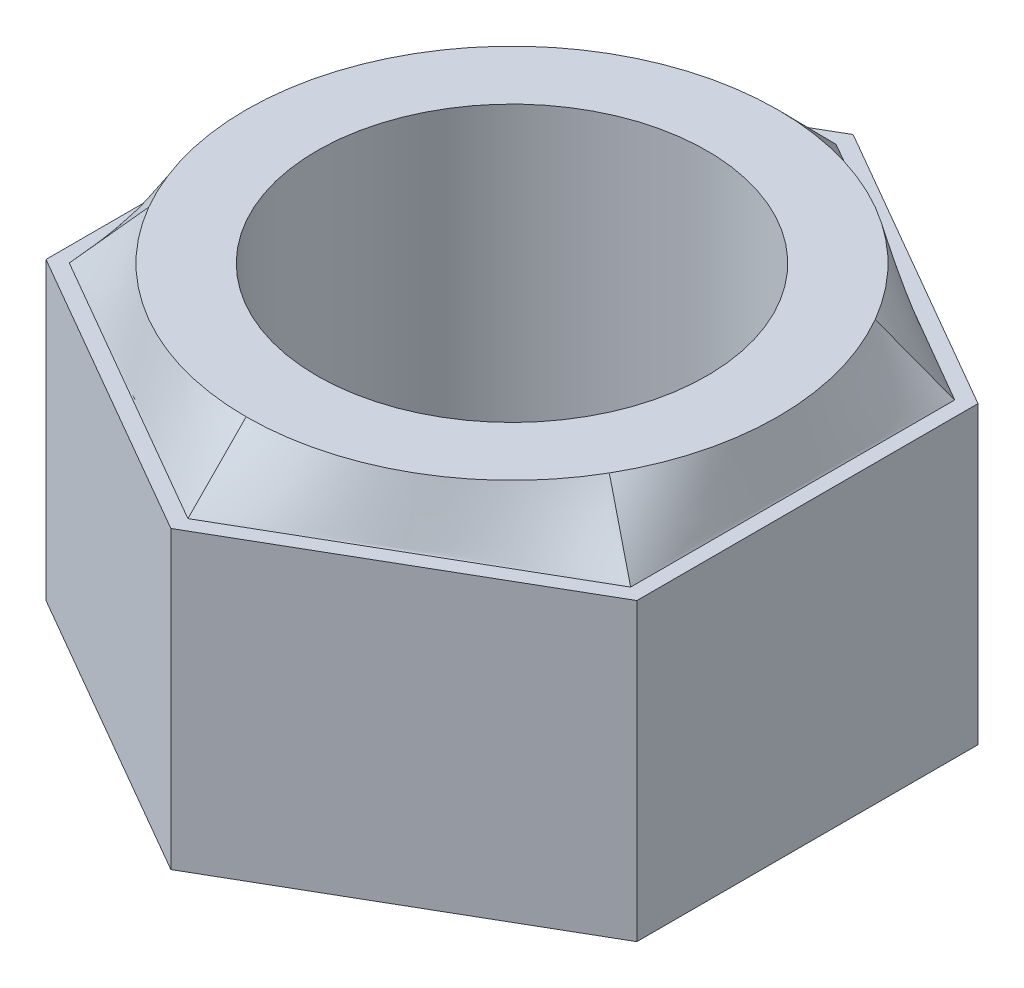
ISO-10303-21;
HEADER;
FILE_DESCRIPTION(('STEP AP214'),'2;1');
FILE_NAME('part.step','',(''),(''),'','','');
FILE_SCHEMA(('AUTOMOTIVE_DESIGN { 1 0 10303 214 1 1 1 1 }'));
ENDSEC;
DATA;
#1=APPLICATION_CONTEXT('core data for automotive mechanical design processes');
#2=APPLICATION_PROTOCOL_DEFINITION('international standard','automotive_design',2000,#1);
#3=PRODUCT_CONTEXT('',#1,'mechanical');
#4=PRODUCT('Part','Part','',(#3));
#5=PRODUCT_RELATED_PRODUCT_CATEGORY('part','',(#4));
#6=PRODUCT_DEFINITION_FORMATION('','',#4);
#7=PRODUCT_DEFINITION_CONTEXT('part definition',#1,'design');
#8=PRODUCT_DEFINITION('design','',#6,#7);
#9=PRODUCT_DEFINITION_SHAPE('','',#8);
#10=(LENGTH_UNIT() NAMED_UNIT(*) SI_UNIT(.MILLI.,.METRE.));
#11=(NAMED_UNIT(*) PLANE_ANGLE_UNIT() SI_UNIT($,.RADIAN.));
#12=(NAMED_UNIT(*) SI_UNIT($,.STERADIAN.) SOLID_ANGLE_UNIT());
#13=UNCERTAINTY_MEASURE_WITH_UNIT(LENGTH_MEASURE(1.E-05),#10,'distance_accuracy_value','');
#14=(GEOMETRIC_REPRESENTATION_CONTEXT(3) GLOBAL_UNCERTAINTY_ASSIGNED_CONTEXT((#13)) GLOBAL_UNIT_ASSIGNED_CONTEXT((#10,
#11,#12)) REPRESENTATION_CONTEXT('',''));
#15=CARTESIAN_POINT('',(0.,0.,0.));
#16=DIRECTION('',(0.,0.,1.));
#17=DIRECTION('',(1.,0.,0.));
#18=AXIS2_PLACEMENT_3D('',#15,#16,#17);
#19=CARTESIAN_POINT('',(0.,5.,0.));
#20=DIRECTION('',(0.,1.,0.));
#21=DIRECTION('',(0.,0.,1.));
#22=AXIS2_PLACEMENT_3D('',#19,#20,#21);
#23=PLANE('',#22);
#24=DIRECTION('',(-0.866025403784438,0.,-0.5));
#25=VECTOR('',#24,1.);
#26=CARTESIAN_POINT('',(5.,5.,-2.88675134594813));
#27=LINE('',#26,#25);
#28=CARTESIAN_POINT('',(5.,5.,-2.88675134594813));
#29=VERTEX_POINT('',#28);
#30=CARTESIAN_POINT('',(0.,5.,-5.77350269189626));
#31=VERTEX_POINT('',#30);
#32=EDGE_CURVE('E186',#29,#31,#27,.T.);
#33=ORIENTED_EDGE('',*,*,#32,.T.);
#34=DIRECTION('',(-0.866025403784438,0.,0.5));
#35=VECTOR('',#34,1.);
#36=CARTESIAN_POINT('',(0.,5.,-5.77350269189626));
#37=LINE('',#36,#35);
#38=CARTESIAN_POINT('',(-5.,5.,-2.88675134594813));
#39=VERTEX_POINT('',#38);
#40=EDGE_CURVE('E137',#31,#39,#37,.T.);
#41=ORIENTED_EDGE('',*,*,#40,.T.);
#42=DIRECTION('',(0.,0.,1.));
#43=VECTOR('',#42,1.);
#44=CARTESIAN_POINT('',(-5.,5.,-2.88675134594813));
#45=LINE('',#44,#43);
#46=CARTESIAN_POINT('',(-5.,5.,2.88675134594813));
#47=VERTEX_POINT('',#46);
#48=EDGE_CURVE('E153',#39,#47,#45,.T.);
#49=ORIENTED_EDGE('',*,*,#48,.T.);
#50=DIRECTION('',(0.866025403784439,0.,0.5));
#51=VECTOR('',#50,1.);
#52=CARTESIAN_POINT('',(-5.,5.,2.88675134594813));
#53=LINE('',#52,#51);
#54=CARTESIAN_POINT('',(0.,5.,5.77350269189626));
#55=VERTEX_POINT('',#54);
#56=EDGE_CURVE('E146',#47,#55,#53,.T.);
#57=ORIENTED_EDGE('',*,*,#56,.T.);
#58=DIRECTION('',(0.866025403784439,0.,-0.5));
#59=VECTOR('',#58,1.);
#60=CARTESIAN_POINT('',(0.,5.,5.77350269189626));
#61=LINE('',#60,#59);
#62=CARTESIAN_POINT('',(5.,5.,2.88675134594813));
#63=VERTEX_POINT('',#62);
#64=EDGE_CURVE('E150',#55,#63,#61,.T.);
#65=ORIENTED_EDGE('',*,*,#64,.T.);
#66=DIRECTION('',(0.,0.,-1.));
#67=VECTOR('',#66,1.);
#68=CARTESIAN_POINT('',(5.,5.,2.88675134594813));
#69=LINE('',#68,#67);
#70=EDGE_CURVE('E102',#63,#29,#69,.T.);
#71=ORIENTED_EDGE('',*,*,#70,.T.);
#72=EDGE_LOOP('',(#33,#41,#49,#57,#65,#71));
#73=FACE_BOUND('',#72,.T.);
#74=DIRECTION('',(-0.866025403784438,0.,-0.5));
#75=VECTOR('',#74,1.);
#76=CARTESIAN_POINT('',(4.75,5.,-2.74241377865072));
#77=LINE('',#76,#75);
#78=CARTESIAN_POINT('',(4.75,5.,-2.74241377865072));
#79=VERTEX_POINT('',#78);
#80=CARTESIAN_POINT('',(0.,5.,-5.48482755730145));
#81=VERTEX_POINT('',#80);
#82=EDGE_CURVE('E194',#79,#81,#77,.T.);
#83=ORIENTED_EDGE('',*,*,#82,.F.);
#84=DIRECTION('',(0.,0.,-1.));
#85=VECTOR('',#84,1.);
#86=CARTESIAN_POINT('',(4.75,5.,2.74241377865072));
#87=LINE('',#86,#85);
#88=CARTESIAN_POINT('',(4.75,5.,2.74241377865072));
#89=VERTEX_POINT('',#88);
#90=EDGE_CURVE('E192',#89,#79,#87,.T.);
#91=ORIENTED_EDGE('',*,*,#90,.F.);
#92=DIRECTION('',(0.866025403784439,0.,-0.5));
#93=VECTOR('',#92,1.);
#94=CARTESIAN_POINT('',(0.,5.,5.48482755730145));
#95=LINE('',#94,#93);
#96=CARTESIAN_POINT('',(0.,5.,5.48482755730145));
#97=VERTEX_POINT('',#96);
#98=EDGE_CURVE('E198',#97,#89,#95,.T.);
#99=ORIENTED_EDGE('',*,*,#98,.F.);
#100=DIRECTION('',(0.866025403784439,0.,0.5));
#101=VECTOR('',#100,1.);
#102=CARTESIAN_POINT('',(-4.75,5.,2.74241377865073));
#103=LINE('',#102,#101);
#104=CARTESIAN_POINT('',(-4.75,5.,2.74241377865073));
#105=VERTEX_POINT('',#104);
#106=EDGE_CURVE('E202',#105,#97,#103,.T.);
#107=ORIENTED_EDGE('',*,*,#106,.F.);
#108=DIRECTION('',(0.,0.,1.));
#109=VECTOR('',#108,1.);
#110=CARTESIAN_POINT('',(-4.75,5.,-2.74241377865072));
#111=LINE('',#110,#109);
#112=CARTESIAN_POINT('',(-4.75,5.,-2.74241377865072));
#113=VERTEX_POINT('',#112);
#114=EDGE_CURVE('E207',#113,#105,#111,.T.);
#115=ORIENTED_EDGE('',*,*,#114,.F.);
#116=DIRECTION('',(-0.866025403784439,0.,0.5));
#117=VECTOR('',#116,1.);
#118=CARTESIAN_POINT('',(0.,5.,-5.48482755730145));
#119=LINE('',#118,#117);
#120=EDGE_CURVE('E212',#81,#113,#119,.T.);
#121=ORIENTED_EDGE('',*,*,#120,.F.);
#122=EDGE_LOOP('',(#83,#91,#99,#107,#115,#121));
#123=FACE_BOUND('',#122,.T.);
#124=ADVANCED_FACE('F76',(#73,#123),#23,.T.);
#125=CARTESIAN_POINT('',(5.,5.,-2.88675134594813));
#126=DIRECTION('',(-0.5,0.,0.866025403784438));
#127=DIRECTION('',(0.866025403784439,0.,0.5));
#128=AXIS2_PLACEMENT_3D('',#125,#126,#127);
#129=PLANE('',#128);
#130=DIRECTION('',(-0.866025403784438,0.,-0.5));
#131=VECTOR('',#130,1.);
#132=CARTESIAN_POINT('',(5.,0.,-2.88675134594813));
#133=LINE('',#132,#131);
#134=CARTESIAN_POINT('',(5.,0.,-2.88675134594813));
#135=VERTEX_POINT('',#134);
#136=CARTESIAN_POINT('',(0.,0.,-5.77350269189626));
#137=VERTEX_POINT('',#136);
#138=EDGE_CURVE('E174',#135,#137,#133,.T.);
#139=ORIENTED_EDGE('',*,*,#138,.T.);
#140=DIRECTION('',(0.,-1.,0.));
#141=VECTOR('',#140,1.);
#142=CARTESIAN_POINT('',(0.,5.,-5.77350269189626));
#143=LINE('',#142,#141);
#144=EDGE_CURVE('E12',#31,#137,#143,.T.);
#145=ORIENTED_EDGE('',*,*,#144,.F.);
#146=ORIENTED_EDGE('',*,*,#32,.F.);
#147=DIRECTION('',(0.,-1.,0.));
#148=VECTOR('',#147,1.);
#149=CARTESIAN_POINT('',(5.,5.,-2.88675134594813));
#150=LINE('',#149,#148);
#151=EDGE_CURVE('E170',#29,#135,#150,.T.);
#152=ORIENTED_EDGE('',*,*,#151,.T.);
#153=EDGE_LOOP('',(#139,#145,#146,#152));
#154=FACE_BOUND('',#153,.T.);
#155=ADVANCED_FACE('F78',(#154),#129,.F.);
#156=CARTESIAN_POINT('',(0.,5.,-5.77350269189626));
#157=DIRECTION('',(0.5,0.,0.866025403784439));
#158=DIRECTION('',(0.866025403784439,0.,-0.5));
#159=AXIS2_PLACEMENT_3D('',#156,#157,#158);
#160=PLANE('',#159);
#161=DIRECTION('',(-0.866025403784438,0.,0.5));
#162=VECTOR('',#161,1.);
#163=CARTESIAN_POINT('',(0.,0.,-5.77350269189626));
#164=LINE('',#163,#162);
#165=CARTESIAN_POINT('',(-5.,0.,-2.88675134594813));
#166=VERTEX_POINT('',#165);
#167=EDGE_CURVE('E177',#137,#166,#164,.T.);
#168=ORIENTED_EDGE('',*,*,#167,.T.);
#169=DIRECTION('',(0.,-1.,0.));
#170=VECTOR('',#169,1.);
#171=CARTESIAN_POINT('',(-5.,5.,-2.88675134594813));
#172=LINE('',#171,#170);
#173=EDGE_CURVE('E85',#39,#166,#172,.T.);
#174=ORIENTED_EDGE('',*,*,#173,.F.);
#175=ORIENTED_EDGE('',*,*,#40,.F.);
#176=ORIENTED_EDGE('',*,*,#144,.T.);
#177=EDGE_LOOP('',(#168,#174,#175,#176));
#178=FACE_BOUND('',#177,.T.);
#179=ADVANCED_FACE('F461',(#178),#160,.F.);
#180=CARTESIAN_POINT('',(-5.,5.,-2.88675134594813));
#181=DIRECTION('',(1.,0.,0.));
#182=DIRECTION('',(0.,0.,-1.));
#183=AXIS2_PLACEMENT_3D('',#180,#181,#182);
#184=PLANE('',#183);
#185=DIRECTION('',(0.,0.,1.));
#186=VECTOR('',#185,1.);
#187=CARTESIAN_POINT('',(-5.,0.,-2.88675134594813));
#188=LINE('',#187,#186);
#189=CARTESIAN_POINT('',(-5.,0.,2.88675134594813));
#190=VERTEX_POINT('',#189);
#191=EDGE_CURVE('E180',#166,#190,#188,.T.);
#192=ORIENTED_EDGE('',*,*,#191,.T.);
#193=DIRECTION('',(0.,-1.,0.));
#194=VECTOR('',#193,1.);
#195=CARTESIAN_POINT('',(-5.,5.,2.88675134594813));
#196=LINE('',#195,#194);
#197=EDGE_CURVE('E165',#47,#190,#196,.T.);
#198=ORIENTED_EDGE('',*,*,#197,.F.);
#199=ORIENTED_EDGE('',*,*,#48,.F.);
#200=ORIENTED_EDGE('',*,*,#173,.T.);
#201=EDGE_LOOP('',(#192,#198,#199,#200));
#202=FACE_BOUND('',#201,.T.);
#203=ADVANCED_FACE('F466',(#202),#184,.F.);
#204=CARTESIAN_POINT('',(-5.,5.,2.88675134594813));
#205=DIRECTION('',(0.5,0.,-0.866025403784439));
#206=DIRECTION('',(-0.866025403784439,0.,-0.5));
#207=AXIS2_PLACEMENT_3D('',#204,#205,#206);
#208=PLANE('',#207);
#209=DIRECTION('',(0.866025403784439,0.,0.5));
#210=VECTOR('',#209,1.);
#211=CARTESIAN_POINT('',(-5.,0.,2.88675134594813));
#212=LINE('',#211,#210);
#213=CARTESIAN_POINT('',(0.,0.,5.77350269189626));
#214=VERTEX_POINT('',#213);
#215=EDGE_CURVE('E162',#190,#214,#212,.T.);
#216=ORIENTED_EDGE('',*,*,#215,.T.);
#217=DIRECTION('',(0.,-1.,0.));
#218=VECTOR('',#217,1.);
#219=CARTESIAN_POINT('',(0.,5.,5.77350269189626));
#220=LINE('',#219,#218);
#221=EDGE_CURVE('E159',#55,#214,#220,.T.);
#222=ORIENTED_EDGE('',*,*,#221,.F.);
#223=ORIENTED_EDGE('',*,*,#56,.F.);
#224=ORIENTED_EDGE('',*,*,#197,.T.);
#225=EDGE_LOOP('',(#216,#222,#223,#224));
#226=FACE_BOUND('',#225,.T.);
#227=ADVANCED_FACE('F160',(#226),#208,.F.);
#228=CARTESIAN_POINT('',(0.,5.,5.77350269189626));
#229=DIRECTION('',(-0.5,0.,-0.866025403784439));
#230=DIRECTION('',(-0.866025403784439,0.,0.5));
#231=AXIS2_PLACEMENT_3D('',#228,#229,#230);
#232=PLANE('',#231);
#233=DIRECTION('',(0.866025403784439,0.,-0.5));
#234=VECTOR('',#233,1.);
#235=CARTESIAN_POINT('',(0.,0.,5.77350269189626));
#236=LINE('',#235,#234);
#237=CARTESIAN_POINT('',(5.,0.,2.88675134594813));
#238=VERTEX_POINT('',#237);
#239=EDGE_CURVE('E183',#214,#238,#236,.T.);
#240=ORIENTED_EDGE('',*,*,#239,.T.);
#241=DIRECTION('',(0.,-1.,0.));
#242=VECTOR('',#241,1.);
#243=CARTESIAN_POINT('',(5.,5.,2.88675134594813));
#244=LINE('',#243,#242);
#245=EDGE_CURVE('E166',#63,#238,#244,.T.);
#246=ORIENTED_EDGE('',*,*,#245,.F.);
#247=ORIENTED_EDGE('',*,*,#64,.F.);
#248=ORIENTED_EDGE('',*,*,#221,.T.);
#249=EDGE_LOOP('',(#240,#246,#247,#248));
#250=FACE_BOUND('',#249,.T.);
#251=ADVANCED_FACE('F168',(#250),#232,.F.);
#252=CARTESIAN_POINT('',(5.,5.,2.88675134594813));
#253=DIRECTION('',(-1.,0.,0.));
#254=DIRECTION('',(0.,0.,1.));
#255=AXIS2_PLACEMENT_3D('',#252,#253,#254);
#256=PLANE('',#255);
#257=DIRECTION('',(0.,0.,-1.));
#258=VECTOR('',#257,1.);
#259=CARTESIAN_POINT('',(5.,0.,2.88675134594813));
#260=LINE('',#259,#258);
#261=EDGE_CURVE('E129',#238,#135,#260,.T.);
#262=ORIENTED_EDGE('',*,*,#261,.T.);
#263=ORIENTED_EDGE('',*,*,#151,.F.);
#264=ORIENTED_EDGE('',*,*,#70,.F.);
#265=ORIENTED_EDGE('',*,*,#245,.T.);
#266=EDGE_LOOP('',(#262,#263,#264,#265));
#267=FACE_BOUND('',#266,.T.);
#268=ADVANCED_FACE('F482',(#267),#256,.F.);
#269=CARTESIAN_POINT('',(0.,0.,0.));
#270=DIRECTION('',(0.,1.,0.));
#271=DIRECTION('',(0.,0.,1.));
#272=AXIS2_PLACEMENT_3D('',#269,#270,#271);
#273=PLANE('',#272);
#274=CARTESIAN_POINT('',(0.,0.,0.));
#275=DIRECTION('',(0.,1.,0.));
#276=DIRECTION('',(0.,0.,1.));
#277=AXIS2_PLACEMENT_3D('',#274,#275,#276);
#278=CIRCLE('',#277,3.3);
#279=CARTESIAN_POINT('',(0.,0.,3.3));
#280=VERTEX_POINT('',#279);
#281=EDGE_CURVE('E195',#280,#280,#278,.T.);
#282=ORIENTED_EDGE('',*,*,#281,.T.);
#283=EDGE_LOOP('',(#282));
#284=FACE_BOUND('',#283,.T.);
#285=ORIENTED_EDGE('',*,*,#138,.F.);
#286=ORIENTED_EDGE('',*,*,#261,.F.);
#287=ORIENTED_EDGE('',*,*,#239,.F.);
#288=ORIENTED_EDGE('',*,*,#215,.F.);
#289=ORIENTED_EDGE('',*,*,#191,.F.);
#290=ORIENTED_EDGE('',*,*,#167,.F.);
#291=EDGE_LOOP('',(#285,#286,#287,#288,#289,#290));
#292=FACE_BOUND('',#291,.T.);
#293=ADVANCED_FACE('F305',(#284,#292),#273,.F.);
#294=CARTESIAN_POINT('',(0.,6.,0.));
#295=DIRECTION('',(0.,1.,0.));
#296=DIRECTION('',(0.,0.,1.));
#297=AXIS2_PLACEMENT_3D('',#294,#295,#296);
#298=PLANE('',#297);
#299=CARTESIAN_POINT('',(0.,6.,0.));
#300=DIRECTION('',(0.,1.,0.));
#301=DIRECTION('',(0.,0.,1.));
#302=AXIS2_PLACEMENT_3D('',#299,#300,#301);
#303=CIRCLE('',#302,3.3);
#304=CARTESIAN_POINT('',(0.,6.,3.3));
#305=VERTEX_POINT('',#304);
#306=EDGE_CURVE('E448',#305,#305,#303,.T.);
#307=ORIENTED_EDGE('',*,*,#306,.F.);
#308=EDGE_LOOP('',(#307));
#309=FACE_BOUND('',#308,.T.);
#310=CARTESIAN_POINT('',(0.,6.,0.));
#311=DIRECTION('',(0.,1.,0.));
#312=DIRECTION('',(0.,0.,1.));
#313=AXIS2_PLACEMENT_3D('',#310,#311,#312);
#314=CIRCLE('',#313,4.5);
#315=CARTESIAN_POINT('',(0.,6.,-4.5));
#316=VERTEX_POINT('',#315);
#317=CARTESIAN_POINT('',(-3.89711431702997,6.,-2.25));
#318=VERTEX_POINT('',#317);
#319=EDGE_CURVE('E178',#316,#318,#314,.T.);
#320=ORIENTED_EDGE('',*,*,#319,.T.);
#321=CARTESIAN_POINT('',(-3.89711431702997,6.,2.25));
#322=VERTEX_POINT('',#321);
#323=EDGE_CURVE('E360',#318,#322,#314,.T.);
#324=ORIENTED_EDGE('',*,*,#323,.T.);
#325=CARTESIAN_POINT('',(0.,6.,4.5));
#326=VERTEX_POINT('',#325);
#327=EDGE_CURVE('E259',#322,#326,#314,.T.);
#328=ORIENTED_EDGE('',*,*,#327,.T.);
#329=CARTESIAN_POINT('',(3.89711431702997,6.,2.25));
#330=VERTEX_POINT('',#329);
#331=EDGE_CURVE('E348',#326,#330,#314,.T.);
#332=ORIENTED_EDGE('',*,*,#331,.T.);
#333=CARTESIAN_POINT('',(3.89711431702998,6.,-2.25));
#334=VERTEX_POINT('',#333);
#335=EDGE_CURVE('E340',#330,#334,#314,.T.);
#336=ORIENTED_EDGE('',*,*,#335,.T.);
#337=EDGE_CURVE('E237',#334,#316,#314,.T.);
#338=ORIENTED_EDGE('',*,*,#337,.T.);
#339=EDGE_LOOP('',(#320,#324,#328,#332,#336,#338));
#340=FACE_BOUND('',#339,.T.);
#341=ADVANCED_FACE('F296',(#309,#340),#298,.T.);
#342=CARTESIAN_POINT('',(-4.75,5.,-2.74241377865072));
#343=CARTESIAN_POINT('',(-3.89711431702997,6.,-2.25));
#344=CARTESIAN_POINT('',(-4.75,5.,-2.28534481554227));
#345=CARTESIAN_POINT('',(-4.08461431702997,6.,-1.92524047358084));
#346=CARTESIAN_POINT('',(-4.75,5.,-1.82827585243381));
#347=CARTESIAN_POINT('',(-4.23737497693061,6.,-1.56542307169303));
#348=CARTESIAN_POINT('',(-4.75,5.,-0.914137926216906));
#349=CARTESIAN_POINT('',(-4.44523642827263,6.,-0.80359765135576));
#350=CARTESIAN_POINT('',(-4.75,5.,-0.457068963108452));
#351=CARTESIAN_POINT('',(-4.5,6.,-0.401923788646685));
#352=CARTESIAN_POINT('',(-4.75,5.,0.457068963108456));
#353=CARTESIAN_POINT('',(-4.5,6.,0.401923788646683));
#354=CARTESIAN_POINT('',(-4.75,5.,0.91413792621691));
#355=CARTESIAN_POINT('',(-4.44523642827263,6.,0.803597651355758));
#356=CARTESIAN_POINT('',(-4.75,5.,1.82827585243382));
#357=CARTESIAN_POINT('',(-4.23737497693061,6.,1.56542307169303));
#358=CARTESIAN_POINT('',(-4.75,5.,2.28534481554227));
#359=CARTESIAN_POINT('',(-4.08461431702997,6.,1.92524047358084));
#360=CARTESIAN_POINT('',(-4.75,5.,2.74241377865072));
#361=CARTESIAN_POINT('',(-3.89711431702997,6.,2.25));
#362=B_SPLINE_SURFACE_WITH_KNOTS('',3,1,((#342,#343),(#344,#345),(#346,#347),(#348,#349),(#350,
#351),(#352,#353),(#354,#355),(#356,#357),(#358,#359),(#360,#361)),.UNSPECIFIED.,.F.,.F.,.F.,(4,
2,2,2,4),(2,2),(0.,0.25,0.5,0.75,1.),(0.,1.),.UNSPECIFIED.);
#363=DIRECTION('',(0.607673576820941,0.712491238808023,-0.350840503156994));
#364=VECTOR('',#363,1.);
#365=CARTESIAN_POINT('',(-4.32355715851499,5.5,2.49620688932536));
#366=LINE('',#365,#364);
#367=EDGE_CURVE('E250',#105,#322,#366,.T.);
#368=DIRECTION('',(-0.607673576820942,-0.712491238808023,-0.350840503156992));
#369=VECTOR('',#368,1.);
#370=CARTESIAN_POINT('',(-4.32355715851499,5.5,-2.49620688932536));
#371=LINE('',#370,#369);
#372=EDGE_CURVE('E201',#318,#113,#371,.T.);
#373=ORIENTED_EDGE('',*,*,#114,.T.);
#374=ORIENTED_EDGE('',*,*,#367,.T.);
#375=ORIENTED_EDGE('',*,*,#323,.F.);
#376=ORIENTED_EDGE('',*,*,#372,.T.);
#377=EDGE_LOOP('',(#373,#374,#375,#376));
#378=FACE_BOUND('',#377,.T.);
#379=ADVANCED_FACE('F247',(#378),#362,.T.);
#380=CARTESIAN_POINT('',(-4.75,5.,2.74241377865073));
#381=CARTESIAN_POINT('',(-3.89711431702997,6.,2.25));
#382=CARTESIAN_POINT('',(-4.35416666666667,5.,2.97094826020495));
#383=CARTESIAN_POINT('',(-3.70961431702997,6.,2.57475952641916));
#384=CARTESIAN_POINT('',(-3.95833333333333,5.,3.19948274175918));
#385=CARTESIAN_POINT('',(-3.47438363622173,6.,2.8869628395359));
#386=CARTESIAN_POINT('',(-3.16666666666667,5.,3.65655170486763));
#387=CARTESIAN_POINT('',(-2.91855419463191,6.,3.44788884703422));
#388=CARTESIAN_POINT('',(-2.77083333333333,5.,3.88508618642186));
#389=CARTESIAN_POINT('',(-2.59807621135332,6.,3.69615242270663));
#390=CARTESIAN_POINT('',(-1.97916666666666,5.,4.34215514953031));
#391=CARTESIAN_POINT('',(-1.90192378864668,6.,4.09807621135331));
#392=CARTESIAN_POINT('',(-1.58333333333333,5.,4.57068963108454));
#393=CARTESIAN_POINT('',(-1.52668223364072,6.,4.25148649838998));
#394=CARTESIAN_POINT('',(-0.791666666666666,5.,5.02775859419299));
#395=CARTESIAN_POINT('',(-0.762991340708876,6.,4.45238591122892));
#396=CARTESIAN_POINT('',(-0.395833333333333,5.,5.25629307574722));
#397=CARTESIAN_POINT('',(-0.375,6.,4.5));
#398=CARTESIAN_POINT('',(0.,5.,5.48482755730145));
#399=CARTESIAN_POINT('',(0.,6.,4.5));
#400=B_SPLINE_SURFACE_WITH_KNOTS('',3,1,((#380,#381),(#382,#383),(#384,#385),(#386,#387),(#388,
#389),(#390,#391),(#392,#393),(#394,#395),(#396,#397),(#398,#399)),.UNSPECIFIED.,.F.,.F.,.F.,(4,
2,2,2,4),(2,2),(0.,0.25,0.5,0.75,1.),(0.,1.),.UNSPECIFIED.);
#401=DIRECTION('',(0.,0.712491238808022,-0.701681006313987));
#402=VECTOR('',#401,1.);
#403=CARTESIAN_POINT('',(0.,5.5,4.99241377865072));
#404=LINE('',#403,#402);
#405=EDGE_CURVE('E261',#97,#326,#404,.T.);
#406=ORIENTED_EDGE('',*,*,#106,.T.);
#407=ORIENTED_EDGE('',*,*,#405,.T.);
#408=ORIENTED_EDGE('',*,*,#327,.F.);
#409=ORIENTED_EDGE('',*,*,#367,.F.);
#410=EDGE_LOOP('',(#406,#407,#408,#409));
#411=FACE_BOUND('',#410,.T.);
#412=ADVANCED_FACE('F255',(#411),#400,.T.);
#413=CARTESIAN_POINT('',(0.,5.,-5.48482755730145));
#414=CARTESIAN_POINT('',(0.,6.,-4.5));
#415=CARTESIAN_POINT('',(-0.395833333333335,5.,-5.25629307574722));
#416=CARTESIAN_POINT('',(-0.374999999999999,6.,-4.5));
#417=CARTESIAN_POINT('',(-0.791666666666669,5.,-5.02775859419299));
#418=CARTESIAN_POINT('',(-0.762991340708876,6.,-4.45238591122892));
#419=CARTESIAN_POINT('',(-1.58333333333334,5.,-4.57068963108454));
#420=CARTESIAN_POINT('',(-1.52668223364072,6.,-4.25148649838998));
#421=CARTESIAN_POINT('',(-1.97916666666667,5.,-4.34215514953031));
#422=CARTESIAN_POINT('',(-1.90192378864668,6.,-4.09807621135332));
#423=CARTESIAN_POINT('',(-2.77083333333334,5.,-3.88508618642186));
#424=CARTESIAN_POINT('',(-2.59807621135332,6.,-3.69615242270663));
#425=CARTESIAN_POINT('',(-3.16666666666667,5.,-3.65655170486763));
#426=CARTESIAN_POINT('',(-2.91855419463191,6.,-3.44788884703422));
#427=CARTESIAN_POINT('',(-3.95833333333334,5.,-3.19948274175918));
#428=CARTESIAN_POINT('',(-3.47438363622173,6.,-2.8869628395359));
#429=CARTESIAN_POINT('',(-4.35416666666667,5.,-2.97094826020495));
#430=CARTESIAN_POINT('',(-3.70961431702997,6.,-2.57475952641917));
#431=CARTESIAN_POINT('',(-4.75,5.,-2.74241377865072));
#432=CARTESIAN_POINT('',(-3.89711431702997,6.,-2.25));
#433=B_SPLINE_SURFACE_WITH_KNOTS('',3,1,((#413,#414),(#415,#416),(#417,#418),(#419,#420),(#421,
#422),(#423,#424),(#425,#426),(#427,#428),(#429,#430),(#431,#432)),.UNSPECIFIED.,.F.,.F.,.F.,(4,
2,2,2,4),(2,2),(0.,0.25,0.5,0.75,1.),(0.,1.),.UNSPECIFIED.);
#434=DIRECTION('',(0.,0.712491238808023,0.701681006313987));
#435=VECTOR('',#434,1.);
#436=CARTESIAN_POINT('',(0.,5.5,-4.99241377865072));
#437=LINE('',#436,#435);
#438=EDGE_CURVE('E224',#81,#316,#437,.T.);
#439=ORIENTED_EDGE('',*,*,#120,.T.);
#440=ORIENTED_EDGE('',*,*,#372,.F.);
#441=ORIENTED_EDGE('',*,*,#319,.F.);
#442=ORIENTED_EDGE('',*,*,#438,.F.);
#443=EDGE_LOOP('',(#439,#440,#441,#442));
#444=FACE_BOUND('',#443,.T.);
#445=ADVANCED_FACE('F231',(#444),#433,.T.);
#446=CARTESIAN_POINT('',(0.,5.,5.48482755730145));
#447=CARTESIAN_POINT('',(0.,6.,4.5));
#448=CARTESIAN_POINT('',(0.395833333333333,5.,5.25629307574722));
#449=CARTESIAN_POINT('',(0.375,6.,4.5));
#450=CARTESIAN_POINT('',(0.791666666666666,5.,5.02775859419299));
#451=CARTESIAN_POINT('',(0.762991340708876,6.,4.45238591122892));
#452=CARTESIAN_POINT('',(1.58333333333333,5.,4.57068963108454));
#453=CARTESIAN_POINT('',(1.52668223364072,6.,4.25148649838998));
#454=CARTESIAN_POINT('',(1.97916666666667,5.,4.34215514953031));
#455=CARTESIAN_POINT('',(1.90192378864668,6.,4.09807621135332));
#456=CARTESIAN_POINT('',(2.77083333333333,5.,3.88508618642186));
#457=CARTESIAN_POINT('',(2.59807621135332,6.,3.69615242270663));
#458=CARTESIAN_POINT('',(3.16666666666667,5.,3.65655170486763));
#459=CARTESIAN_POINT('',(2.91855419463191,6.,3.44788884703422));
#460=CARTESIAN_POINT('',(3.95833333333334,5.,3.19948274175918));
#461=CARTESIAN_POINT('',(3.47438363622173,6.,2.88696283953589));
#462=CARTESIAN_POINT('',(4.35416666666667,5.,2.97094826020495));
#463=CARTESIAN_POINT('',(3.70961431702998,6.,2.57475952641916));
#464=CARTESIAN_POINT('',(4.75000000000001,5.,2.74241377865072));
#465=CARTESIAN_POINT('',(3.89711431702997,6.,2.25));
#466=B_SPLINE_SURFACE_WITH_KNOTS('',3,1,((#446,#447),(#448,#449),(#450,#451),(#452,#453),(#454,
#455),(#456,#457),(#458,#459),(#460,#461),(#462,#463),(#464,#465)),.UNSPECIFIED.,.F.,.F.,.F.,(4,
2,2,2,4),(2,2),(0.,0.25,0.5,0.75,1.),(0.,1.),.UNSPECIFIED.);
#467=DIRECTION('',(-0.607673576820943,0.712491238808022,-0.350840503156993));
#468=VECTOR('',#467,1.);
#469=CARTESIAN_POINT('',(4.32355715851499,5.5,2.49620688932536));
#470=LINE('',#469,#468);
#471=EDGE_CURVE('E263',#89,#330,#470,.T.);
#472=ORIENTED_EDGE('',*,*,#98,.T.);
#473=ORIENTED_EDGE('',*,*,#471,.T.);
#474=ORIENTED_EDGE('',*,*,#331,.F.);
#475=ORIENTED_EDGE('',*,*,#405,.F.);
#476=EDGE_LOOP('',(#472,#473,#474,#475));
#477=FACE_BOUND('',#476,.T.);
#478=ADVANCED_FACE('F404',(#477),#466,.T.);
#479=CARTESIAN_POINT('',(4.75,5.,2.74241377865072));
#480=CARTESIAN_POINT('',(3.89711431702997,6.,2.25));
#481=CARTESIAN_POINT('',(4.75,5.,2.28534481554227));
#482=CARTESIAN_POINT('',(4.08461431702997,6.,1.92524047358083));
#483=CARTESIAN_POINT('',(4.75,5.,1.82827585243382));
#484=CARTESIAN_POINT('',(4.23737497693061,6.,1.56542307169302));
#485=CARTESIAN_POINT('',(4.75,5.,0.914137926216912));
#486=CARTESIAN_POINT('',(4.44523642827263,6.,0.803597651355759));
#487=CARTESIAN_POINT('',(4.75,5.,0.45706896310846));
#488=CARTESIAN_POINT('',(4.5,6.,0.401923788646684));
#489=CARTESIAN_POINT('',(4.75,5.,-0.457068963108447));
#490=CARTESIAN_POINT('',(4.5,6.,-0.401923788646683));
#491=CARTESIAN_POINT('',(4.75,5.,-0.914137926216902));
#492=CARTESIAN_POINT('',(4.44523642827263,6.,-0.803597651355757));
#493=CARTESIAN_POINT('',(4.75,5.,-1.82827585243381));
#494=CARTESIAN_POINT('',(4.23737497693061,6.,-1.56542307169302));
#495=CARTESIAN_POINT('',(4.75,5.,-2.28534481554226));
#496=CARTESIAN_POINT('',(4.08461431702997,6.,-1.92524047358083));
#497=CARTESIAN_POINT('',(4.75,5.,-2.74241377865072));
#498=CARTESIAN_POINT('',(3.89711431702998,6.,-2.25));
#499=B_SPLINE_SURFACE_WITH_KNOTS('',3,1,((#479,#480),(#481,#482),(#483,#484),(#485,#486),(#487,
#488),(#489,#490),(#491,#492),(#493,#494),(#495,#496),(#497,#498)),.UNSPECIFIED.,.F.,.F.,.F.,(4,
2,2,2,4),(2,2),(0.,0.25,0.5,0.75,1.),(0.,1.),.UNSPECIFIED.);
#500=DIRECTION('',(-0.607673576820942,0.712491238808023,0.350840503156992));
#501=VECTOR('',#500,1.);
#502=CARTESIAN_POINT('',(4.32355715851499,5.5,-2.49620688932536));
#503=LINE('',#502,#501);
#504=EDGE_CURVE('E93',#79,#334,#503,.T.);
#505=ORIENTED_EDGE('',*,*,#90,.T.);
#506=ORIENTED_EDGE('',*,*,#504,.T.);
#507=ORIENTED_EDGE('',*,*,#335,.F.);
#508=ORIENTED_EDGE('',*,*,#471,.F.);
#509=EDGE_LOOP('',(#505,#506,#507,#508));
#510=FACE_BOUND('',#509,.T.);
#511=ADVANCED_FACE('F291',(#510),#499,.T.);
#512=CARTESIAN_POINT('',(4.75,5.,-2.74241377865072));
#513=CARTESIAN_POINT('',(3.89711431702998,6.,-2.25));
#514=CARTESIAN_POINT('',(4.35416666666667,5.,-2.97094826020495));
#515=CARTESIAN_POINT('',(3.70961431702998,6.,-2.57475952641916));
#516=CARTESIAN_POINT('',(3.95833333333334,5.,-3.19948274175917));
#517=CARTESIAN_POINT('',(3.47438363622174,6.,-2.88696283953589));
#518=CARTESIAN_POINT('',(3.16666666666667,5.,-3.65655170486763));
#519=CARTESIAN_POINT('',(2.91855419463191,6.,-3.44788884703422));
#520=CARTESIAN_POINT('',(2.77083333333334,5.,-3.88508618642185));
#521=CARTESIAN_POINT('',(2.59807621135332,6.,-3.69615242270663));
#522=CARTESIAN_POINT('',(1.97916666666667,5.,-4.34215514953031));
#523=CARTESIAN_POINT('',(1.90192378864669,6.,-4.09807621135332));
#524=CARTESIAN_POINT('',(1.58333333333334,5.,-4.57068963108453));
#525=CARTESIAN_POINT('',(1.52668223364072,6.,-4.25148649838998));
#526=CARTESIAN_POINT('',(0.79166666666667,5.,-5.02775859419299));
#527=CARTESIAN_POINT('',(0.762991340708877,6.,-4.45238591122892));
#528=CARTESIAN_POINT('',(0.395833333333335,5.,-5.25629307574722));
#529=CARTESIAN_POINT('',(0.375000000000001,6.,-4.5));
#530=CARTESIAN_POINT('',(0.,5.,-5.48482755730145));
#531=CARTESIAN_POINT('',(0.,6.,-4.5));
#532=B_SPLINE_SURFACE_WITH_KNOTS('',3,1,((#512,#513),(#514,#515),(#516,#517),(#518,#519),(#520,
#521),(#522,#523),(#524,#525),(#526,#527),(#528,#529),(#530,#531)),.UNSPECIFIED.,.F.,.F.,.F.,(4,
2,2,2,4),(2,2),(0.,0.25,0.5,0.75,1.),(0.,1.),.UNSPECIFIED.);
#533=ORIENTED_EDGE('',*,*,#82,.T.);
#534=ORIENTED_EDGE('',*,*,#438,.T.);
#535=ORIENTED_EDGE('',*,*,#337,.F.);
#536=ORIENTED_EDGE('',*,*,#504,.F.);
#537=EDGE_LOOP('',(#533,#534,#535,#536));
#538=FACE_BOUND('',#537,.T.);
#539=ADVANCED_FACE('F222',(#538),#532,.T.);
#540=CARTESIAN_POINT('',(0.,6.,0.));
#541=DIRECTION('',(0.,1.,0.));
#542=DIRECTION('',(0.,0.,1.));
#543=AXIS2_PLACEMENT_3D('',#540,#541,#542);
#544=CYLINDRICAL_SURFACE('',#543,3.3);
#545=ORIENTED_EDGE('',*,*,#281,.F.);
#546=EDGE_LOOP('',(#545));
#547=FACE_BOUND('',#546,.T.);
#548=ORIENTED_EDGE('',*,*,#306,.T.);
#549=EDGE_LOOP('',(#548));
#550=FACE_BOUND('',#549,.T.);
#551=ADVANCED_FACE('F290',(#547,#550),#544,.F.);
#552=CLOSED_SHELL('',(#124,#155,#179,#203,#227,#251,#268,#293,#341,#379,#412,#445,#478,#511,
#539,#551));
#553=MANIFOLD_SOLID_BREP('B2',#552);
#554=ADVANCED_BREP_SHAPE_REPRESENTATION('',(#18,#553),#14);
#555=SHAPE_DEFINITION_REPRESENTATION(#9,#554);
ENDSEC;
END-ISO-10303-21;
